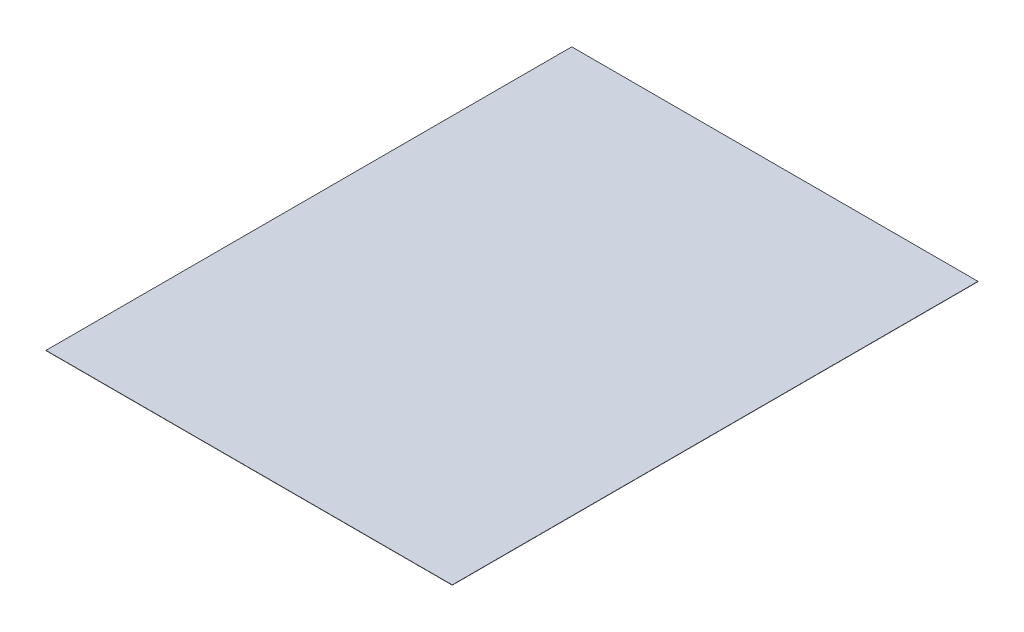
ISO-10303-21;
HEADER;
FILE_DESCRIPTION(('STEP AP214'),'2;1');
FILE_NAME('part.step','',(''),(''),'','','');
FILE_SCHEMA(('AUTOMOTIVE_DESIGN { 1 0 10303 214 1 1 1 1 }'));
ENDSEC;
DATA;
#1=APPLICATION_CONTEXT('core data for automotive mechanical design processes');
#2=APPLICATION_PROTOCOL_DEFINITION('international standard','automotive_design',2000,#1);
#3=PRODUCT_CONTEXT('',#1,'mechanical');
#4=PRODUCT('Part','Part','',(#3));
#5=PRODUCT_RELATED_PRODUCT_CATEGORY('part','',(#4));
#6=PRODUCT_DEFINITION_FORMATION('','',#4);
#7=PRODUCT_DEFINITION_CONTEXT('part definition',#1,'design');
#8=PRODUCT_DEFINITION('design','',#6,#7);
#9=PRODUCT_DEFINITION_SHAPE('','',#8);
#10=(LENGTH_UNIT() NAMED_UNIT(*) SI_UNIT(.MILLI.,.METRE.));
#11=(NAMED_UNIT(*) PLANE_ANGLE_UNIT() SI_UNIT($,.RADIAN.));
#12=(NAMED_UNIT(*) SI_UNIT($,.STERADIAN.) SOLID_ANGLE_UNIT());
#13=UNCERTAINTY_MEASURE_WITH_UNIT(LENGTH_MEASURE(1.E-05),#10,'distance_accuracy_value','');
#14=(GEOMETRIC_REPRESENTATION_CONTEXT(3) GLOBAL_UNCERTAINTY_ASSIGNED_CONTEXT((#13)) GLOBAL_UNIT_ASSIGNED_CONTEXT((#10,
#11,#12)) REPRESENTATION_CONTEXT('',''));
#15=CARTESIAN_POINT('',(0.,0.,0.));
#16=DIRECTION('',(0.,0.,1.));
#17=DIRECTION('',(1.,0.,0.));
#18=AXIS2_PLACEMENT_3D('',#15,#16,#17);
#19=CARTESIAN_POINT('',(0.,0.127,0.));
#20=DIRECTION('',(1.,0.,0.));
#21=DIRECTION('',(0.,0.,-1.));
#22=AXIS2_PLACEMENT_3D('',#19,#20,#21);
#23=PLANE('',#22);
#24=DIRECTION('',(0.,0.,1.));
#25=VECTOR('',#24,1.);
#26=CARTESIAN_POINT('',(0.,0.,0.));
#27=LINE('',#26,#25);
#28=CARTESIAN_POINT('',(0.,0.,-279.4));
#29=VERTEX_POINT('',#28);
#30=CARTESIAN_POINT('',(0.,0.,0.));
#31=VERTEX_POINT('',#30);
#32=EDGE_CURVE('E107',#29,#31,#27,.T.);
#33=ORIENTED_EDGE('',*,*,#32,.T.);
#34=DIRECTION('',(0.,-1.,0.));
#35=VECTOR('',#34,1.);
#36=CARTESIAN_POINT('',(0.,0.127,0.));
#37=LINE('',#36,#35);
#38=CARTESIAN_POINT('',(0.,0.127,0.));
#39=VERTEX_POINT('',#38);
#40=EDGE_CURVE('E11',#39,#31,#37,.T.);
#41=ORIENTED_EDGE('',*,*,#40,.F.);
#42=DIRECTION('',(0.,0.,1.));
#43=VECTOR('',#42,1.);
#44=CARTESIAN_POINT('',(0.,0.127,0.));
#45=LINE('',#44,#43);
#46=CARTESIAN_POINT('',(0.,0.127,-279.4));
#47=VERTEX_POINT('',#46);
#48=EDGE_CURVE('E91',#47,#39,#45,.T.);
#49=ORIENTED_EDGE('',*,*,#48,.F.);
#50=DIRECTION('',(0.,-1.,0.));
#51=VECTOR('',#50,1.);
#52=CARTESIAN_POINT('',(0.,0.127,-279.4));
#53=LINE('',#52,#51);
#54=EDGE_CURVE('E103',#47,#29,#53,.T.);
#55=ORIENTED_EDGE('',*,*,#54,.T.);
#56=EDGE_LOOP('',(#33,#41,#49,#55));
#57=FACE_BOUND('',#56,.T.);
#58=ADVANCED_FACE('F39',(#57),#23,.F.);
#59=CARTESIAN_POINT('',(0.,0.127,0.));
#60=DIRECTION('',(0.,0.,-1.));
#61=DIRECTION('',(-1.,0.,0.));
#62=AXIS2_PLACEMENT_3D('',#59,#60,#61);
#63=PLANE('',#62);
#64=DIRECTION('',(1.,0.,0.));
#65=VECTOR('',#64,1.);
#66=CARTESIAN_POINT('',(0.,0.,0.));
#67=LINE('',#66,#65);
#68=CARTESIAN_POINT('',(215.9,0.,0.));
#69=VERTEX_POINT('',#68);
#70=EDGE_CURVE('E96',#31,#69,#67,.T.);
#71=ORIENTED_EDGE('',*,*,#70,.T.);
#72=DIRECTION('',(0.,-1.,0.));
#73=VECTOR('',#72,1.);
#74=CARTESIAN_POINT('',(215.9,0.127,0.));
#75=LINE('',#74,#73);
#76=CARTESIAN_POINT('',(215.9,0.127,0.));
#77=VERTEX_POINT('',#76);
#78=EDGE_CURVE('E48',#77,#69,#75,.T.);
#79=ORIENTED_EDGE('',*,*,#78,.F.);
#80=DIRECTION('',(1.,0.,0.));
#81=VECTOR('',#80,1.);
#82=CARTESIAN_POINT('',(0.,0.127,0.));
#83=LINE('',#82,#81);
#84=EDGE_CURVE('E86',#39,#77,#83,.T.);
#85=ORIENTED_EDGE('',*,*,#84,.F.);
#86=ORIENTED_EDGE('',*,*,#40,.T.);
#87=EDGE_LOOP('',(#71,#79,#85,#86));
#88=FACE_BOUND('',#87,.T.);
#89=ADVANCED_FACE('F95',(#88),#63,.F.);
#90=CARTESIAN_POINT('',(215.9,0.127,0.));
#91=DIRECTION('',(-1.,0.,0.));
#92=DIRECTION('',(0.,0.,1.));
#93=AXIS2_PLACEMENT_3D('',#90,#91,#92);
#94=PLANE('',#93);
#95=DIRECTION('',(0.,0.,-1.));
#96=VECTOR('',#95,1.);
#97=CARTESIAN_POINT('',(215.9,0.,0.));
#98=LINE('',#97,#96);
#99=CARTESIAN_POINT('',(215.9,0.,-279.4));
#100=VERTEX_POINT('',#99);
#101=EDGE_CURVE('E73',#69,#100,#98,.T.);
#102=ORIENTED_EDGE('',*,*,#101,.T.);
#103=DIRECTION('',(0.,-1.,0.));
#104=VECTOR('',#103,1.);
#105=CARTESIAN_POINT('',(215.9,0.127,-279.4));
#106=LINE('',#105,#104);
#107=CARTESIAN_POINT('',(215.9,0.127,-279.4));
#108=VERTEX_POINT('',#107);
#109=EDGE_CURVE('E98',#108,#100,#106,.T.);
#110=ORIENTED_EDGE('',*,*,#109,.F.);
#111=DIRECTION('',(0.,0.,-1.));
#112=VECTOR('',#111,1.);
#113=CARTESIAN_POINT('',(215.9,0.127,0.));
#114=LINE('',#113,#112);
#115=EDGE_CURVE('E89',#77,#108,#114,.T.);
#116=ORIENTED_EDGE('',*,*,#115,.F.);
#117=ORIENTED_EDGE('',*,*,#78,.T.);
#118=EDGE_LOOP('',(#102,#110,#116,#117));
#119=FACE_BOUND('',#118,.T.);
#120=ADVANCED_FACE('F99',(#119),#94,.F.);
#121=CARTESIAN_POINT('',(0.,0.127,-279.4));
#122=DIRECTION('',(0.,0.,1.));
#123=DIRECTION('',(1.,0.,0.));
#124=AXIS2_PLACEMENT_3D('',#121,#122,#123);
#125=PLANE('',#124);
#126=DIRECTION('',(-1.,0.,0.));
#127=VECTOR('',#126,1.);
#128=CARTESIAN_POINT('',(0.,0.,-279.4));
#129=LINE('',#128,#127);
#130=EDGE_CURVE('E79',#100,#29,#129,.T.);
#131=ORIENTED_EDGE('',*,*,#130,.T.);
#132=ORIENTED_EDGE('',*,*,#54,.F.);
#133=DIRECTION('',(-1.,0.,0.));
#134=VECTOR('',#133,1.);
#135=CARTESIAN_POINT('',(0.,0.127,-279.4));
#136=LINE('',#135,#134);
#137=EDGE_CURVE('E56',#108,#47,#136,.T.);
#138=ORIENTED_EDGE('',*,*,#137,.F.);
#139=ORIENTED_EDGE('',*,*,#109,.T.);
#140=EDGE_LOOP('',(#131,#132,#138,#139));
#141=FACE_BOUND('',#140,.T.);
#142=ADVANCED_FACE('F120',(#141),#125,.F.);
#143=CARTESIAN_POINT('',(0.,0.127,0.));
#144=DIRECTION('',(0.,-1.,0.));
#145=DIRECTION('',(0.,0.,-1.));
#146=AXIS2_PLACEMENT_3D('',#143,#144,#145);
#147=PLANE('',#146);
#148=ORIENTED_EDGE('',*,*,#48,.T.);
#149=ORIENTED_EDGE('',*,*,#84,.T.);
#150=ORIENTED_EDGE('',*,*,#115,.T.);
#151=ORIENTED_EDGE('',*,*,#137,.T.);
#152=EDGE_LOOP('',(#148,#149,#150,#151));
#153=FACE_BOUND('',#152,.T.);
#154=ADVANCED_FACE('F87',(#153),#147,.F.);
#155=CARTESIAN_POINT('',(0.,0.,0.));
#156=DIRECTION('',(0.,-1.,0.));
#157=DIRECTION('',(0.,0.,-1.));
#158=AXIS2_PLACEMENT_3D('',#155,#156,#157);
#159=PLANE('',#158);
#160=ORIENTED_EDGE('',*,*,#32,.F.);
#161=ORIENTED_EDGE('',*,*,#130,.F.);
#162=ORIENTED_EDGE('',*,*,#101,.F.);
#163=ORIENTED_EDGE('',*,*,#70,.F.);
#164=EDGE_LOOP('',(#160,#161,#162,#163));
#165=FACE_BOUND('',#164,.T.);
#166=ADVANCED_FACE('F123',(#165),#159,.T.);
#167=CLOSED_SHELL('',(#58,#89,#120,#142,#154,#166));
#168=MANIFOLD_SOLID_BREP('B2',#167);
#169=ADVANCED_BREP_SHAPE_REPRESENTATION('',(#18,#168),#14);
#170=SHAPE_DEFINITION_REPRESENTATION(#9,#169);
ENDSEC;
END-ISO-10303-21;
